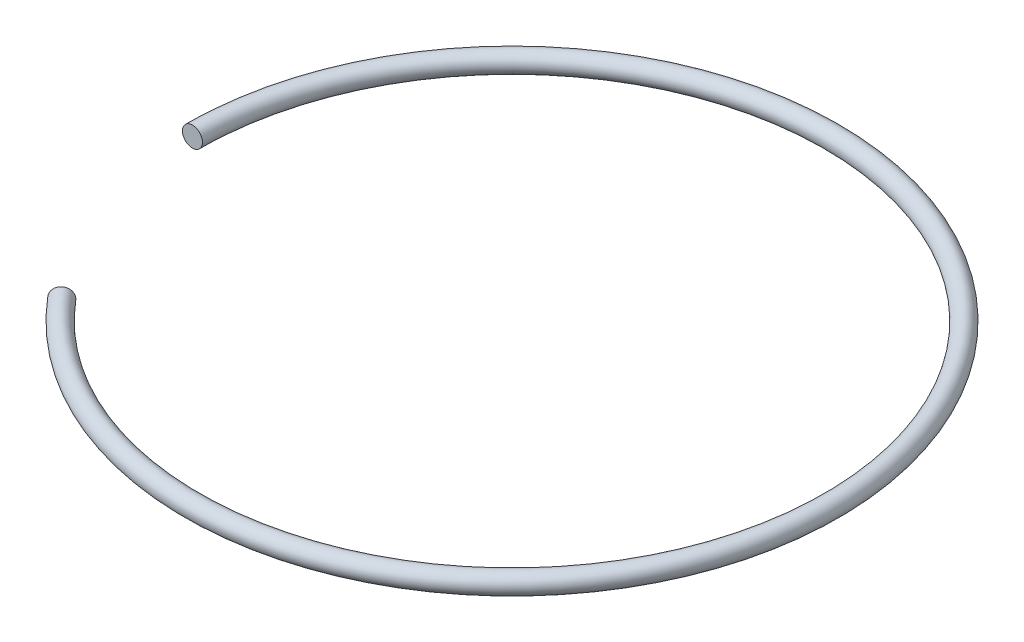
ISO-10303-21;
HEADER;
FILE_DESCRIPTION(('STEP AP214'),'2;1');
FILE_NAME('part.step','',(''),(''),'','','');
FILE_SCHEMA(('AUTOMOTIVE_DESIGN { 1 0 10303 214 1 1 1 1 }'));
ENDSEC;
DATA;
#1=APPLICATION_CONTEXT('core data for automotive mechanical design processes');
#2=APPLICATION_PROTOCOL_DEFINITION('international standard','automotive_design',2000,#1);
#3=PRODUCT_CONTEXT('',#1,'mechanical');
#4=PRODUCT('Part','Part','',(#3));
#5=PRODUCT_RELATED_PRODUCT_CATEGORY('part','',(#4));
#6=PRODUCT_DEFINITION_FORMATION('','',#4);
#7=PRODUCT_DEFINITION_CONTEXT('part definition',#1,'design');
#8=PRODUCT_DEFINITION('design','',#6,#7);
#9=PRODUCT_DEFINITION_SHAPE('','',#8);
#10=(LENGTH_UNIT() NAMED_UNIT(*) SI_UNIT(.MILLI.,.METRE.));
#11=(NAMED_UNIT(*) PLANE_ANGLE_UNIT() SI_UNIT($,.RADIAN.));
#12=(NAMED_UNIT(*) SI_UNIT($,.STERADIAN.) SOLID_ANGLE_UNIT());
#13=UNCERTAINTY_MEASURE_WITH_UNIT(LENGTH_MEASURE(1.E-05),#10,'distance_accuracy_value','');
#14=(GEOMETRIC_REPRESENTATION_CONTEXT(3) GLOBAL_UNCERTAINTY_ASSIGNED_CONTEXT((#13)) GLOBAL_UNIT_ASSIGNED_CONTEXT((#10,
#11,#12)) REPRESENTATION_CONTEXT('',''));
#15=CARTESIAN_POINT('',(0.,0.,0.));
#16=DIRECTION('',(0.,0.,1.));
#17=DIRECTION('',(1.,0.,0.));
#18=AXIS2_PLACEMENT_3D('',#15,#16,#17);
#19=CARTESIAN_POINT('',(0.,0.,0.));
#20=DIRECTION('',(0.,0.,1.));
#21=DIRECTION('',(1.,0.,0.));
#22=AXIS2_PLACEMENT_3D('',#19,#20,#21);
#23=PLANE('',#22);
#24=CARTESIAN_POINT('',(-3.937,2.794,0.));
#25=CARTESIAN_POINT('',(-3.93700944163282,2.77974826288538,0.));
#26=CARTESIAN_POINT('',(-3.93943461075752,2.76544598968039,0.));
#27=CARTESIAN_POINT('',(-3.9488836758503,2.73847859021723,0.));
#28=CARTESIAN_POINT('',(-3.95590757181837,2.72581346395905,0.));
#29=CARTESIAN_POINT('',(-3.97375129641328,2.70351456167606,0.));
#30=CARTESIAN_POINT('',(-3.98457112504021,2.69388078565132,0.));
#31=CARTESIAN_POINT('',(-4.00878978285433,2.67873974718197,0.));
#32=CARTESIAN_POINT('',(-4.02218861204153,2.67323248473735,0.));
#33=CARTESIAN_POINT('',(-4.05005387181125,2.66696295640004,0.));
#34=CARTESIAN_POINT('',(-4.06452030239376,2.66620069050733,0.));
#35=CARTESIAN_POINT('',(-4.09288999439974,2.66950774316015,0.));
#36=CARTESIAN_POINT('',(-4.10679325582321,2.67357706170567,0.));
#37=CARTESIAN_POINT('',(-4.132469066047,2.68608832477274,0.));
#38=CARTESIAN_POINT('',(-4.14424161484733,2.69453026929428,0.));
#39=CARTESIAN_POINT('',(-4.16432874931793,2.71483506557817,0.));
#40=CARTESIAN_POINT('',(-4.1726433349882,2.72669791734053,0.));
#41=CARTESIAN_POINT('',(-4.18487713267581,2.7525070693395,0.));
#42=CARTESIAN_POINT('',(-4.18879634469315,2.76645336957613,0.));
#43=CARTESIAN_POINT('',(-4.19179753482757,2.79485708137049,0.));
#44=CARTESIAN_POINT('',(-4.19087951294466,2.80931449292822,0.));
#45=CARTESIAN_POINT('',(-4.18430973463322,2.83711046648027,0.));
#46=CARTESIAN_POINT('',(-4.17865797820469,2.85044902847459,0.));
#47=CARTESIAN_POINT('',(-4.16325792488412,2.87450346842014,0.));
#48=CARTESIAN_POINT('',(-4.15350962799209,2.88521934637137,0.));
#49=CARTESIAN_POINT('',(-4.13101553524897,2.90282033287343,0.));
#50=CARTESIAN_POINT('',(-4.11826973939789,2.90970544142426,0.));
#51=CARTESIAN_POINT('',(-4.09121765920223,2.91886846378864,0.));
#52=CARTESIAN_POINT('',(-4.07691137485765,2.9211463776022,0.));
#53=CARTESIAN_POINT('',(-4.04835117305317,2.92083887070183,0.));
#54=CARTESIAN_POINT('',(-4.03409725559328,2.9182534499879,0.));
#55=CARTESIAN_POINT('',(-4.00724906858565,2.90850823133198,0.));
#56=CARTESIAN_POINT('',(-3.99465479903792,2.90134843339,0.));
#57=CARTESIAN_POINT('',(-3.972544846024,2.8832711125656,0.));
#58=CARTESIAN_POINT('',(-3.96302916255781,2.87235358968318,0.));
#59=CARTESIAN_POINT('',(-3.94815282361355,2.84795645861023,0.));
#60=CARTESIAN_POINT('',(-3.94279216813546,2.83447685041972,0.));
#61=CARTESIAN_POINT('',(-3.9379344960858,2.81182007193611,0.));
#62=CARTESIAN_POINT('',(-3.93699409063308,2.80291993423916,0.));
#63=CARTESIAN_POINT('',(-3.937,2.794,0.));
#64=B_SPLINE_CURVE_WITH_KNOTS('',3,(#24,#25,#26,#27,#28,#29,#30,#31,#32,#33,#34,#35,#36,#37,#38,
#39,#40,#41,#42,#43,#44,#45,#46,#47,#48,#49,#50,#51,#52,#53,#54,#55,#56,#57,#58,#59,#60,#61,#62,
#63),.UNSPECIFIED.,.T.,.F.,(4,2,2,2,2,2,2,2,2,2,2,2,2,2,2,2,2,2,2,4),(0.,0.0426429642402329,
0.0852859284804657,0.127928892721775,0.170571856963084,0.213214821204393,0.255857785445703,
0.298500749687012,0.34114371392832,0.383786678169629,0.426429642410938,0.469072606652247,
0.511715570893556,0.554358535134865,0.597001499376175,0.639644463617482,0.682287427858792,
0.724930392100101,0.76757335634141,0.794262905392616),.UNSPECIFIED.);
#65=CARTESIAN_POINT('',(-3.937,2.794,0.));
#66=VERTEX_POINT('',#65);
#67=EDGE_CURVE('E19',#66,#66,#64,.T.);
#68=ORIENTED_EDGE('',*,*,#67,.F.);
#69=EDGE_LOOP('',(#68));
#70=FACE_BOUND('',#69,.T.);
#71=ADVANCED_FACE('F15',(#70),#23,.T.);
#72=CARTESIAN_POINT('',(0.,0.,0.));
#73=DIRECTION('',(0.64278760968653,0.,0.766044443118986));
#74=DIRECTION('',(0.766044443118986,0.,-0.64278760968653));
#75=AXIS2_PLACEMENT_3D('',#72,#73,#74);
#76=PLANE('',#75);
#77=CARTESIAN_POINT('',(-3.01591697255945,2.794,2.53065481933587));
#78=CARTESIAN_POINT('',(-3.01592420526981,2.80825173711462,2.53066088830046));
#79=CARTESIAN_POINT('',(-3.01778199260141,2.82255401031961,2.53221975696522));
#80=CARTESIAN_POINT('',(-3.0250203964084,2.84952140978277,2.53829349892997));
#81=CARTESIAN_POINT('',(-3.03040101288379,2.86218653604095,2.54280837222998));
#82=CARTESIAN_POINT('',(-3.04407009895426,2.88448543832394,2.55427809731024));
#83=CARTESIAN_POINT('',(-3.05235856854942,2.89411921434868,2.56123294909056));
#84=CARTESIAN_POINT('',(-3.07091113678773,2.90926025281803,2.57680040225672));
#85=CARTESIAN_POINT('',(-3.08117523543088,2.91476751526265,2.58541300364256));
#86=CARTESIAN_POINT('',(-3.10252126283354,2.92103704359996,2.60332444736323));
#87=CARTESIAN_POINT('',(-3.11360319159304,2.92179930949267,2.61262328969806));
#88=CARTESIAN_POINT('',(-3.13533563650722,2.91849225683985,2.63085897621013));
#89=CARTESIAN_POINT('',(-3.1459861526619,2.91442293829433,2.63979582038736));
#90=CARTESIAN_POINT('',(-3.16565496440641,2.90191167522726,2.65629991306788));
#91=CARTESIAN_POINT('',(-3.17467325999625,2.89346973070572,2.66386716157116));
#92=CARTESIAN_POINT('',(-3.19006089773563,2.87316493442183,2.67677892272297));
#93=CARTESIAN_POINT('',(-3.19643023988518,2.86130208265948,2.6821234353715));
#94=CARTESIAN_POINT('',(-3.20580187262202,2.8354929306605,2.6899871689445));
#95=CARTESIAN_POINT('',(-3.20880416320931,2.82154663042387,2.69250638986898));
#96=CARTESIAN_POINT('',(-3.21110320823452,2.79314291862951,2.6944355177017));
#97=CARTESIAN_POINT('',(-3.21039996267246,2.77868550707178,2.69384542460995));
#98=CARTESIAN_POINT('',(-3.20536722050445,2.75088953351973,2.68962245251296));
#99=CARTESIAN_POINT('',(-3.20103772389851,2.73755097152541,2.68598957350774));
#100=CARTESIAN_POINT('',(-3.18924059862856,2.71349653157986,2.67609061004477));
#101=CARTESIAN_POINT('',(-3.18177296996454,2.70278065362863,2.66982452558702));
#102=CARTESIAN_POINT('',(-3.16454149521568,2.68517966712657,2.65536560148061));
#103=CARTESIAN_POINT('',(-3.15477764913083,2.67829455857574,2.64717276183194));
#104=CARTESIAN_POINT('',(-3.13405455342213,2.66913153621136,2.62978401986592));
#105=CARTESIAN_POINT('',(-3.12309530379829,2.6668536223978,2.62058811754857));
#106=CARTESIAN_POINT('',(-3.10121691991161,2.66716112929817,2.60222997369851));
#107=CARTESIAN_POINT('',(-3.09029778564878,2.6697465500121,2.59306773216579));
#108=CARTESIAN_POINT('',(-3.06973088118377,2.67949176866802,2.57581005021474));
#109=CARTESIAN_POINT('',(-3.06008311098159,2.68665156661,2.56771460979641));
#110=CARTESIAN_POINT('',(-3.04314590433765,2.7047288874344,2.55350260594831));
#111=CARTESIAN_POINT('',(-3.0358564678959,2.71564641031682,2.54738604251855));
#112=CARTESIAN_POINT('',(-3.02446053111369,2.74004354138977,2.53782371616768));
#113=CARTESIAN_POINT('',(-3.02035403077323,2.75352314958028,2.53437795324657));
#114=CARTESIAN_POINT('',(-3.01663283809309,2.77617992806389,2.53125550184112));
#115=CARTESIAN_POINT('',(-3.01591244572175,2.78508006576084,2.53065102086803));
#116=CARTESIAN_POINT('',(-3.01591697255945,2.794,2.53065481933587));
#117=B_SPLINE_CURVE_WITH_KNOTS('',3,(#77,#78,#79,#80,#81,#82,#83,#84,#85,#86,#87,#88,#89,#90,
#91,#92,#93,#94,#95,#96,#97,#98,#99,#100,#101,#102,#103,#104,#105,#106,#107,#108,#109,#110,#111,
#112,#113,#114,#115,#116),.UNSPECIFIED.,.T.,.F.,(4,2,2,2,2,2,2,2,2,2,2,2,2,2,2,2,2,2,2,4),(0.,
0.0426429642402328,0.0852859284804658,0.127928892721774,0.170571856963083,0.213214821204393,
0.255857785445702,0.298500749687011,0.34114371392832,0.383786678169629,0.426429642410938,
0.469072606652247,0.511715570893556,0.554358535134866,0.597001499376174,0.639644463617483,
0.682287427858792,0.724930392100101,0.767573356341411,0.794262905392616),.UNSPECIFIED.);
#118=CARTESIAN_POINT('',(-3.01591697255945,2.794,2.53065481933587));
#119=VERTEX_POINT('',#118);
#120=EDGE_CURVE('E10',#119,#119,#117,.T.);
#121=ORIENTED_EDGE('',*,*,#120,.F.);
#122=EDGE_LOOP('',(#121));
#123=FACE_BOUND('',#122,.T.);
#124=ADVANCED_FACE('F35',(#123),#76,.F.);
#125=CARTESIAN_POINT('',(0.,2.794,0.));
#126=DIRECTION('',(0.,1.,0.));
#127=DIRECTION('',(0.939692620785911,0.,-0.342020143325663));
#128=AXIS2_PLACEMENT_3D('',#125,#126,#127);
#129=TOROIDAL_SURFACE('',#128,4.064,0.127000000000001);
#130=ORIENTED_EDGE('',*,*,#120,.T.);
#131=EDGE_LOOP('',(#130));
#132=FACE_BOUND('',#131,.T.);
#133=ORIENTED_EDGE('',*,*,#67,.T.);
#134=EDGE_LOOP('',(#133));
#135=FACE_BOUND('',#134,.T.);
#136=ADVANCED_FACE('F37',(#132,#135),#129,.T.);
#137=CLOSED_SHELL('',(#71,#124,#136));
#138=MANIFOLD_SOLID_BREP('B1',#137);
#139=ADVANCED_BREP_SHAPE_REPRESENTATION('',(#18,#138),#14);
#140=SHAPE_DEFINITION_REPRESENTATION(#9,#139);
ENDSEC;
END-ISO-10303-21;
